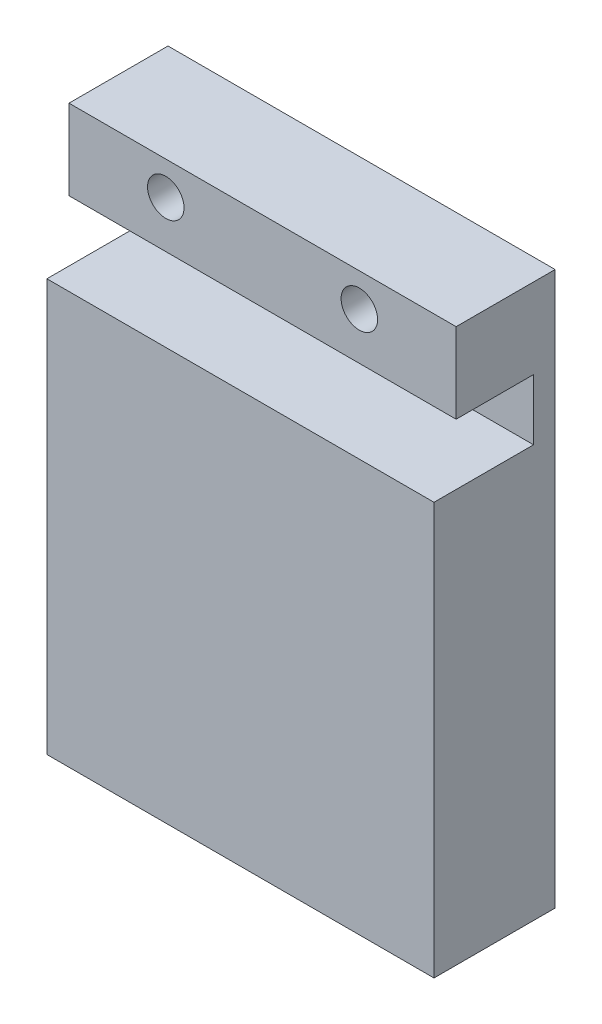
ISO-10303-21;
HEADER;
FILE_DESCRIPTION(('STEP AP214'),'2;1');
FILE_NAME('part.step','',(''),(''),'','','');
FILE_SCHEMA(('AUTOMOTIVE_DESIGN { 1 0 10303 214 1 1 1 1 }'));
ENDSEC;
DATA;
#1=APPLICATION_CONTEXT('core data for automotive mechanical design processes');
#2=APPLICATION_PROTOCOL_DEFINITION('international standard','automotive_design',2000,#1);
#3=PRODUCT_CONTEXT('',#1,'mechanical');
#4=PRODUCT('Part','Part','',(#3));
#5=PRODUCT_RELATED_PRODUCT_CATEGORY('part','',(#4));
#6=PRODUCT_DEFINITION_FORMATION('','',#4);
#7=PRODUCT_DEFINITION_CONTEXT('part definition',#1,'design');
#8=PRODUCT_DEFINITION('design','',#6,#7);
#9=PRODUCT_DEFINITION_SHAPE('','',#8);
#10=(LENGTH_UNIT() NAMED_UNIT(*) SI_UNIT(.MILLI.,.METRE.));
#11=(NAMED_UNIT(*) PLANE_ANGLE_UNIT() SI_UNIT($,.RADIAN.));
#12=(NAMED_UNIT(*) SI_UNIT($,.STERADIAN.) SOLID_ANGLE_UNIT());
#13=UNCERTAINTY_MEASURE_WITH_UNIT(LENGTH_MEASURE(1.E-05),#10,'distance_accuracy_value','');
#14=(GEOMETRIC_REPRESENTATION_CONTEXT(3) GLOBAL_UNCERTAINTY_ASSIGNED_CONTEXT((#13)) GLOBAL_UNIT_ASSIGNED_CONTEXT((#10,
#11,#12)) REPRESENTATION_CONTEXT('',''));
#15=CARTESIAN_POINT('',(0.,0.,0.));
#16=DIRECTION('',(0.,0.,1.));
#17=DIRECTION('',(1.,0.,0.));
#18=AXIS2_PLACEMENT_3D('',#15,#16,#17);
#19=CARTESIAN_POINT('',(17.5,-25.,10.95));
#20=DIRECTION('',(-1.,0.,0.));
#21=DIRECTION('',(0.,0.,1.));
#22=AXIS2_PLACEMENT_3D('',#19,#20,#21);
#23=PLANE('',#22);
#24=DIRECTION('',(0.,1.,0.));
#25=VECTOR('',#24,1.);
#26=CARTESIAN_POINT('',(17.5,25.,8.95));
#27=LINE('',#26,#25);
#28=CARTESIAN_POINT('',(17.5,17.75,8.95));
#29=VERTEX_POINT('',#28);
#30=CARTESIAN_POINT('',(17.5,25.,8.95));
#31=VERTEX_POINT('',#30);
#32=EDGE_CURVE('E104',#29,#31,#27,.T.);
#33=ORIENTED_EDGE('',*,*,#32,.F.);
#34=DIRECTION('',(0.,0.,-1.));
#35=VECTOR('',#34,1.);
#36=CARTESIAN_POINT('',(17.5,17.75,10.95));
#37=LINE('',#36,#35);
#38=CARTESIAN_POINT('',(17.5,17.75,1.95000000000001));
#39=VERTEX_POINT('',#38);
#40=EDGE_CURVE('E112',#29,#39,#37,.T.);
#41=ORIENTED_EDGE('',*,*,#40,.T.);
#42=DIRECTION('',(0.,1.,0.));
#43=VECTOR('',#42,1.);
#44=CARTESIAN_POINT('',(17.5,-25.,1.95000000000001));
#45=LINE('',#44,#43);
#46=CARTESIAN_POINT('',(17.5,12.25,1.95000000000001));
#47=VERTEX_POINT('',#46);
#48=EDGE_CURVE('E125',#47,#39,#45,.T.);
#49=ORIENTED_EDGE('',*,*,#48,.F.);
#50=DIRECTION('',(0.,0.,1.));
#51=VECTOR('',#50,1.);
#52=CARTESIAN_POINT('',(17.5,12.25,10.95));
#53=LINE('',#52,#51);
#54=CARTESIAN_POINT('',(17.5,12.25,10.95));
#55=VERTEX_POINT('',#54);
#56=EDGE_CURVE('E119',#47,#55,#53,.T.);
#57=ORIENTED_EDGE('',*,*,#56,.T.);
#58=DIRECTION('',(0.,1.,0.));
#59=VECTOR('',#58,1.);
#60=CARTESIAN_POINT('',(17.5,-25.,10.95));
#61=LINE('',#60,#59);
#62=CARTESIAN_POINT('',(17.5,-25.,10.95));
#63=VERTEX_POINT('',#62);
#64=EDGE_CURVE('E132',#63,#55,#61,.T.);
#65=ORIENTED_EDGE('',*,*,#64,.F.);
#66=DIRECTION('',(0.,0.,-1.));
#67=VECTOR('',#66,1.);
#68=CARTESIAN_POINT('',(17.5,-25.,10.95));
#69=LINE('',#68,#67);
#70=CARTESIAN_POINT('',(17.5,-25.,0.));
#71=VERTEX_POINT('',#70);
#72=EDGE_CURVE('E140',#63,#71,#69,.T.);
#73=ORIENTED_EDGE('',*,*,#72,.T.);
#74=DIRECTION('',(0.,1.,0.));
#75=VECTOR('',#74,1.);
#76=CARTESIAN_POINT('',(17.5,-25.,0.));
#77=LINE('',#76,#75);
#78=CARTESIAN_POINT('',(17.5,25.,0.));
#79=VERTEX_POINT('',#78);
#80=EDGE_CURVE('E131',#71,#79,#77,.T.);
#81=ORIENTED_EDGE('',*,*,#80,.T.);
#82=DIRECTION('',(0.,0.,-1.));
#83=VECTOR('',#82,1.);
#84=CARTESIAN_POINT('',(17.5,25.,10.95));
#85=LINE('',#84,#83);
#86=EDGE_CURVE('E114',#31,#79,#85,.T.);
#87=ORIENTED_EDGE('',*,*,#86,.F.);
#88=EDGE_LOOP('',(#33,#41,#49,#57,#65,#73,#81,#87));
#89=FACE_BOUND('',#88,.T.);
#90=ADVANCED_FACE('F39',(#89),#23,.F.);
#91=CARTESIAN_POINT('',(-17.5,25.,10.95));
#92=DIRECTION('',(0.,-1.,0.));
#93=DIRECTION('',(0.,0.,-1.));
#94=AXIS2_PLACEMENT_3D('',#91,#92,#93);
#95=PLANE('',#94);
#96=DIRECTION('',(-1.,0.,0.));
#97=VECTOR('',#96,1.);
#98=CARTESIAN_POINT('',(-17.5,25.,8.95));
#99=LINE('',#98,#97);
#100=CARTESIAN_POINT('',(-17.5,25.,8.95));
#101=VERTEX_POINT('',#100);
#102=EDGE_CURVE('E115',#31,#101,#99,.T.);
#103=ORIENTED_EDGE('',*,*,#102,.F.);
#104=ORIENTED_EDGE('',*,*,#86,.T.);
#105=DIRECTION('',(-1.,0.,0.));
#106=VECTOR('',#105,1.);
#107=CARTESIAN_POINT('',(-17.5,25.,0.));
#108=LINE('',#107,#106);
#109=CARTESIAN_POINT('',(-17.5,25.,0.));
#110=VERTEX_POINT('',#109);
#111=EDGE_CURVE('E142',#79,#110,#108,.T.);
#112=ORIENTED_EDGE('',*,*,#111,.T.);
#113=DIRECTION('',(0.,0.,-1.));
#114=VECTOR('',#113,1.);
#115=CARTESIAN_POINT('',(-17.5,25.,10.95));
#116=LINE('',#115,#114);
#117=EDGE_CURVE('E153',#101,#110,#116,.T.);
#118=ORIENTED_EDGE('',*,*,#117,.F.);
#119=EDGE_LOOP('',(#103,#104,#112,#118));
#120=FACE_BOUND('',#119,.T.);
#121=ADVANCED_FACE('F193',(#120),#95,.F.);
#122=CARTESIAN_POINT('',(-17.5,-25.,10.95));
#123=DIRECTION('',(1.,0.,0.));
#124=DIRECTION('',(0.,0.,-1.));
#125=AXIS2_PLACEMENT_3D('',#122,#123,#124);
#126=PLANE('',#125);
#127=DIRECTION('',(0.,-1.,0.));
#128=VECTOR('',#127,1.);
#129=CARTESIAN_POINT('',(-17.5,25.,8.95));
#130=LINE('',#129,#128);
#131=CARTESIAN_POINT('',(-17.5,17.75,8.95));
#132=VERTEX_POINT('',#131);
#133=EDGE_CURVE('E53',#101,#132,#130,.T.);
#134=ORIENTED_EDGE('',*,*,#133,.F.);
#135=ORIENTED_EDGE('',*,*,#117,.T.);
#136=DIRECTION('',(0.,-1.,0.));
#137=VECTOR('',#136,1.);
#138=CARTESIAN_POINT('',(-17.5,-25.,0.));
#139=LINE('',#138,#137);
#140=CARTESIAN_POINT('',(-17.5,-25.,0.));
#141=VERTEX_POINT('',#140);
#142=EDGE_CURVE('E145',#110,#141,#139,.T.);
#143=ORIENTED_EDGE('',*,*,#142,.T.);
#144=DIRECTION('',(0.,0.,-1.));
#145=VECTOR('',#144,1.);
#146=CARTESIAN_POINT('',(-17.5,-25.,10.95));
#147=LINE('',#146,#145);
#148=CARTESIAN_POINT('',(-17.5,-25.,10.95));
#149=VERTEX_POINT('',#148);
#150=EDGE_CURVE('E150',#149,#141,#147,.T.);
#151=ORIENTED_EDGE('',*,*,#150,.F.);
#152=DIRECTION('',(0.,-1.,0.));
#153=VECTOR('',#152,1.);
#154=CARTESIAN_POINT('',(-17.5,-25.,10.95));
#155=LINE('',#154,#153);
#156=CARTESIAN_POINT('',(-17.5,12.25,10.95));
#157=VERTEX_POINT('',#156);
#158=EDGE_CURVE('E135',#157,#149,#155,.T.);
#159=ORIENTED_EDGE('',*,*,#158,.F.);
#160=DIRECTION('',(0.,0.,-1.));
#161=VECTOR('',#160,1.);
#162=CARTESIAN_POINT('',(-17.5,12.25,10.95));
#163=LINE('',#162,#161);
#164=CARTESIAN_POINT('',(-17.5,12.25,1.95000000000001));
#165=VERTEX_POINT('',#164);
#166=EDGE_CURVE('E46',#157,#165,#163,.T.);
#167=ORIENTED_EDGE('',*,*,#166,.T.);
#168=DIRECTION('',(0.,-1.,0.));
#169=VECTOR('',#168,1.);
#170=CARTESIAN_POINT('',(-17.5,-25.,1.95000000000001));
#171=LINE('',#170,#169);
#172=CARTESIAN_POINT('',(-17.5,17.75,1.95000000000001));
#173=VERTEX_POINT('',#172);
#174=EDGE_CURVE('E156',#173,#165,#171,.T.);
#175=ORIENTED_EDGE('',*,*,#174,.F.);
#176=DIRECTION('',(0.,0.,1.));
#177=VECTOR('',#176,1.);
#178=CARTESIAN_POINT('',(-17.5,17.75,10.95));
#179=LINE('',#178,#177);
#180=EDGE_CURVE('E11',#173,#132,#179,.T.);
#181=ORIENTED_EDGE('',*,*,#180,.T.);
#182=EDGE_LOOP('',(#134,#135,#143,#151,#159,#167,#175,#181));
#183=FACE_BOUND('',#182,.T.);
#184=ADVANCED_FACE('F161',(#183),#126,.F.);
#185=CARTESIAN_POINT('',(-8.75,22.,10.95));
#186=DIRECTION('',(0.,0.,-1.));
#187=DIRECTION('',(-1.,0.,0.));
#188=AXIS2_PLACEMENT_3D('',#185,#186,#187);
#189=CYLINDRICAL_SURFACE('',#188,1.65);
#190=CARTESIAN_POINT('',(-8.75,22.,0.));
#191=DIRECTION('',(0.,0.,1.));
#192=DIRECTION('',(1.,0.,0.));
#193=AXIS2_PLACEMENT_3D('',#190,#191,#192);
#194=CIRCLE('',#193,1.65);
#195=CARTESIAN_POINT('',(-7.1,22.,0.));
#196=VERTEX_POINT('',#195);
#197=EDGE_CURVE('E122',#196,#196,#194,.T.);
#198=ORIENTED_EDGE('',*,*,#197,.F.);
#199=EDGE_LOOP('',(#198));
#200=FACE_BOUND('',#199,.T.);
#201=CARTESIAN_POINT('',(-8.75,22.,8.95));
#202=DIRECTION('',(0.,0.,1.));
#203=DIRECTION('',(1.,0.,0.));
#204=AXIS2_PLACEMENT_3D('',#201,#202,#203);
#205=CIRCLE('',#204,1.65);
#206=CARTESIAN_POINT('',(-7.1,22.,8.95));
#207=VERTEX_POINT('',#206);
#208=EDGE_CURVE('E173',#207,#207,#205,.T.);
#209=ORIENTED_EDGE('',*,*,#208,.T.);
#210=EDGE_LOOP('',(#209));
#211=FACE_BOUND('',#210,.T.);
#212=ADVANCED_FACE('F218',(#200,#211),#189,.F.);
#213=CARTESIAN_POINT('',(8.75,22.,10.95));
#214=DIRECTION('',(0.,0.,-1.));
#215=DIRECTION('',(-1.,0.,0.));
#216=AXIS2_PLACEMENT_3D('',#213,#214,#215);
#217=CYLINDRICAL_SURFACE('',#216,1.65);
#218=CARTESIAN_POINT('',(8.75,22.,0.));
#219=DIRECTION('',(0.,0.,1.));
#220=DIRECTION('',(1.,0.,0.));
#221=AXIS2_PLACEMENT_3D('',#218,#219,#220);
#222=CIRCLE('',#221,1.65);
#223=CARTESIAN_POINT('',(10.4,22.,0.));
#224=VERTEX_POINT('',#223);
#225=EDGE_CURVE('E118',#224,#224,#222,.T.);
#226=ORIENTED_EDGE('',*,*,#225,.F.);
#227=EDGE_LOOP('',(#226));
#228=FACE_BOUND('',#227,.T.);
#229=CARTESIAN_POINT('',(8.75,22.,8.95));
#230=DIRECTION('',(0.,0.,1.));
#231=DIRECTION('',(1.,0.,0.));
#232=AXIS2_PLACEMENT_3D('',#229,#230,#231);
#233=CIRCLE('',#232,1.65);
#234=CARTESIAN_POINT('',(10.4,22.,8.95));
#235=VERTEX_POINT('',#234);
#236=EDGE_CURVE('E177',#235,#235,#233,.T.);
#237=ORIENTED_EDGE('',*,*,#236,.T.);
#238=EDGE_LOOP('',(#237));
#239=FACE_BOUND('',#238,.T.);
#240=ADVANCED_FACE('F200',(#228,#239),#217,.F.);
#241=CARTESIAN_POINT('',(-25.,17.75,1.95000000000001));
#242=DIRECTION('',(0.,1.,0.));
#243=DIRECTION('',(0.,0.,1.));
#244=AXIS2_PLACEMENT_3D('',#241,#242,#243);
#245=PLANE('',#244);
#246=DIRECTION('',(1.,0.,0.));
#247=VECTOR('',#246,1.);
#248=CARTESIAN_POINT('',(-17.5,17.75,8.95));
#249=LINE('',#248,#247);
#250=EDGE_CURVE('E101',#132,#29,#249,.T.);
#251=ORIENTED_EDGE('',*,*,#250,.F.);
#252=ORIENTED_EDGE('',*,*,#180,.F.);
#253=DIRECTION('',(-1.,0.,0.));
#254=VECTOR('',#253,1.);
#255=CARTESIAN_POINT('',(-25.,17.75,1.95000000000001));
#256=LINE('',#255,#254);
#257=EDGE_CURVE('E61',#39,#173,#256,.T.);
#258=ORIENTED_EDGE('',*,*,#257,.F.);
#259=ORIENTED_EDGE('',*,*,#40,.F.);
#260=EDGE_LOOP('',(#251,#252,#258,#259));
#261=FACE_BOUND('',#260,.T.);
#262=ADVANCED_FACE('F117',(#261),#245,.F.);
#263=CARTESIAN_POINT('',(0.,0.,10.95));
#264=DIRECTION('',(0.,0.,-1.));
#265=DIRECTION('',(-1.,0.,0.));
#266=AXIS2_PLACEMENT_3D('',#263,#264,#265);
#267=PLANE('',#266);
#268=ORIENTED_EDGE('',*,*,#64,.T.);
#269=DIRECTION('',(1.,0.,0.));
#270=VECTOR('',#269,1.);
#271=CARTESIAN_POINT('',(-25.,12.25,10.95));
#272=LINE('',#271,#270);
#273=EDGE_CURVE('E167',#157,#55,#272,.T.);
#274=ORIENTED_EDGE('',*,*,#273,.F.);
#275=ORIENTED_EDGE('',*,*,#158,.T.);
#276=DIRECTION('',(1.,0.,0.));
#277=VECTOR('',#276,1.);
#278=CARTESIAN_POINT('',(-17.5,-25.,10.95));
#279=LINE('',#278,#277);
#280=EDGE_CURVE('E138',#149,#63,#279,.T.);
#281=ORIENTED_EDGE('',*,*,#280,.T.);
#282=EDGE_LOOP('',(#268,#274,#275,#281));
#283=FACE_BOUND('',#282,.T.);
#284=ADVANCED_FACE('F171',(#283),#267,.F.);
#285=CARTESIAN_POINT('',(0.,0.,0.));
#286=DIRECTION('',(0.,0.,-1.));
#287=DIRECTION('',(-1.,0.,0.));
#288=AXIS2_PLACEMENT_3D('',#285,#286,#287);
#289=PLANE('',#288);
#290=ORIENTED_EDGE('',*,*,#197,.T.);
#291=EDGE_LOOP('',(#290));
#292=FACE_BOUND('',#291,.T.);
#293=ORIENTED_EDGE('',*,*,#80,.F.);
#294=DIRECTION('',(1.,0.,0.));
#295=VECTOR('',#294,1.);
#296=CARTESIAN_POINT('',(-17.5,-25.,0.));
#297=LINE('',#296,#295);
#298=EDGE_CURVE('E136',#141,#71,#297,.T.);
#299=ORIENTED_EDGE('',*,*,#298,.F.);
#300=ORIENTED_EDGE('',*,*,#142,.F.);
#301=ORIENTED_EDGE('',*,*,#111,.F.);
#302=EDGE_LOOP('',(#293,#299,#300,#301));
#303=FACE_BOUND('',#302,.T.);
#304=ORIENTED_EDGE('',*,*,#225,.T.);
#305=EDGE_LOOP('',(#304));
#306=FACE_BOUND('',#305,.T.);
#307=ADVANCED_FACE('F188',(#292,#303,#306),#289,.T.);
#308=CARTESIAN_POINT('',(-17.5,-25.,10.95));
#309=DIRECTION('',(0.,1.,0.));
#310=DIRECTION('',(0.,0.,1.));
#311=AXIS2_PLACEMENT_3D('',#308,#309,#310);
#312=PLANE('',#311);
#313=ORIENTED_EDGE('',*,*,#298,.T.);
#314=ORIENTED_EDGE('',*,*,#72,.F.);
#315=ORIENTED_EDGE('',*,*,#280,.F.);
#316=ORIENTED_EDGE('',*,*,#150,.T.);
#317=EDGE_LOOP('',(#313,#314,#315,#316));
#318=FACE_BOUND('',#317,.T.);
#319=ADVANCED_FACE('F221',(#318),#312,.F.);
#320=CARTESIAN_POINT('',(-25.,12.25,1.95000000000001));
#321=DIRECTION('',(0.,-1.,0.));
#322=DIRECTION('',(0.,0.,-1.));
#323=AXIS2_PLACEMENT_3D('',#320,#321,#322);
#324=PLANE('',#323);
#325=DIRECTION('',(1.,0.,0.));
#326=VECTOR('',#325,1.);
#327=CARTESIAN_POINT('',(-25.,12.25,1.95000000000001));
#328=LINE('',#327,#326);
#329=EDGE_CURVE('E169',#165,#47,#328,.T.);
#330=ORIENTED_EDGE('',*,*,#329,.F.);
#331=ORIENTED_EDGE('',*,*,#166,.F.);
#332=ORIENTED_EDGE('',*,*,#273,.T.);
#333=ORIENTED_EDGE('',*,*,#56,.F.);
#334=EDGE_LOOP('',(#330,#331,#332,#333));
#335=FACE_BOUND('',#334,.T.);
#336=ADVANCED_FACE('F166',(#335),#324,.F.);
#337=CARTESIAN_POINT('',(0.,0.,1.95000000000001));
#338=DIRECTION('',(0.,0.,1.));
#339=DIRECTION('',(1.,0.,0.));
#340=AXIS2_PLACEMENT_3D('',#337,#338,#339);
#341=PLANE('',#340);
#342=ORIENTED_EDGE('',*,*,#48,.T.);
#343=ORIENTED_EDGE('',*,*,#257,.T.);
#344=ORIENTED_EDGE('',*,*,#174,.T.);
#345=ORIENTED_EDGE('',*,*,#329,.T.);
#346=EDGE_LOOP('',(#342,#343,#344,#345));
#347=FACE_BOUND('',#346,.T.);
#348=ADVANCED_FACE('F180',(#347),#341,.T.);
#349=CARTESIAN_POINT('',(0.,0.,8.95));
#350=DIRECTION('',(0.,0.,1.));
#351=DIRECTION('',(1.,0.,0.));
#352=AXIS2_PLACEMENT_3D('',#349,#350,#351);
#353=PLANE('',#352);
#354=ORIENTED_EDGE('',*,*,#208,.F.);
#355=EDGE_LOOP('',(#354));
#356=FACE_BOUND('',#355,.T.);
#357=ORIENTED_EDGE('',*,*,#236,.F.);
#358=EDGE_LOOP('',(#357));
#359=FACE_BOUND('',#358,.T.);
#360=ORIENTED_EDGE('',*,*,#133,.T.);
#361=ORIENTED_EDGE('',*,*,#250,.T.);
#362=ORIENTED_EDGE('',*,*,#32,.T.);
#363=ORIENTED_EDGE('',*,*,#102,.T.);
#364=EDGE_LOOP('',(#360,#361,#362,#363));
#365=FACE_BOUND('',#364,.T.);
#366=ADVANCED_FACE('F103',(#356,#359,#365),#353,.T.);
#367=CLOSED_SHELL('',(#90,#121,#184,#212,#240,#262,#284,#307,#319,#336,#348,#366));
#368=MANIFOLD_SOLID_BREP('B2',#367);
#369=ADVANCED_BREP_SHAPE_REPRESENTATION('',(#18,#368),#14);
#370=SHAPE_DEFINITION_REPRESENTATION(#9,#369);
ENDSEC;
END-ISO-10303-21;
